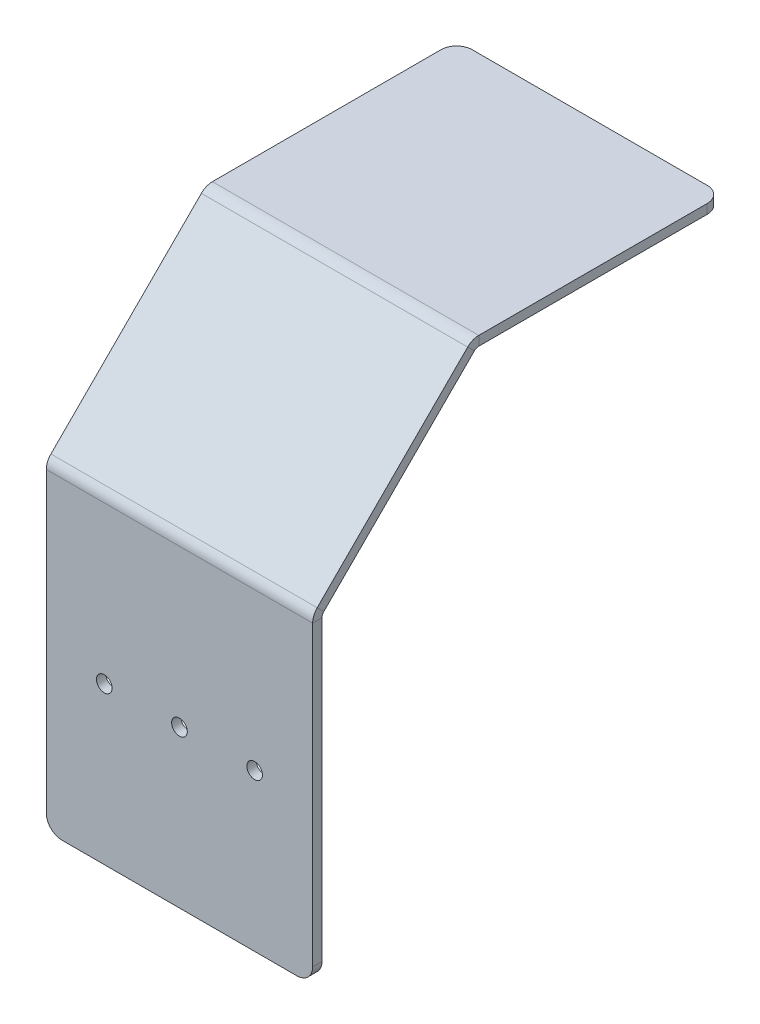
ISO-10303-21;
HEADER;
FILE_DESCRIPTION(('STEP AP214'),'2;1');
FILE_NAME('part.step','',(''),(''),'','','');
FILE_SCHEMA(('AUTOMOTIVE_DESIGN { 1 0 10303 214 1 1 1 1 }'));
ENDSEC;
DATA;
#1=APPLICATION_CONTEXT('core data for automotive mechanical design processes');
#2=APPLICATION_PROTOCOL_DEFINITION('international standard','automotive_design',2000,#1);
#3=PRODUCT_CONTEXT('',#1,'mechanical');
#4=PRODUCT('Part','Part','',(#3));
#5=PRODUCT_RELATED_PRODUCT_CATEGORY('part','',(#4));
#6=PRODUCT_DEFINITION_FORMATION('','',#4);
#7=PRODUCT_DEFINITION_CONTEXT('part definition',#1,'design');
#8=PRODUCT_DEFINITION('design','',#6,#7);
#9=PRODUCT_DEFINITION_SHAPE('','',#8);
#10=(LENGTH_UNIT() NAMED_UNIT(*) SI_UNIT(.MILLI.,.METRE.));
#11=(NAMED_UNIT(*) PLANE_ANGLE_UNIT() SI_UNIT($,.RADIAN.));
#12=(NAMED_UNIT(*) SI_UNIT($,.STERADIAN.) SOLID_ANGLE_UNIT());
#13=UNCERTAINTY_MEASURE_WITH_UNIT(LENGTH_MEASURE(1.E-05),#10,'distance_accuracy_value','');
#14=(GEOMETRIC_REPRESENTATION_CONTEXT(3) GLOBAL_UNCERTAINTY_ASSIGNED_CONTEXT((#13)) GLOBAL_UNIT_ASSIGNED_CONTEXT((#10,
#11,#12)) REPRESENTATION_CONTEXT('',''));
#15=CARTESIAN_POINT('',(0.,0.,0.));
#16=DIRECTION('',(0.,0.,1.));
#17=DIRECTION('',(1.,0.,0.));
#18=AXIS2_PLACEMENT_3D('',#15,#16,#17);
#19=CARTESIAN_POINT('',(42.5,50.,-3.));
#20=DIRECTION('',(1.,0.,0.));
#21=DIRECTION('',(0.,1.,0.));
#22=AXIS2_PLACEMENT_3D('',#19,#20,#21);
#23=PLANE('',#22);
#24=DIRECTION('',(0.,1.,0.));
#25=VECTOR('',#24,1.);
#26=CARTESIAN_POINT('',(42.5,50.,0.));
#27=LINE('',#26,#25);
#28=CARTESIAN_POINT('',(42.5,-45.,0.));
#29=VERTEX_POINT('',#28);
#30=CARTESIAN_POINT('',(42.5,50.,0.));
#31=VERTEX_POINT('',#30);
#32=EDGE_CURVE('E290',#29,#31,#27,.T.);
#33=ORIENTED_EDGE('',*,*,#32,.F.);
#34=DIRECTION('',(0.,0.,1.));
#35=VECTOR('',#34,1.);
#36=CARTESIAN_POINT('',(42.5,-45.,-3.));
#37=LINE('',#36,#35);
#38=CARTESIAN_POINT('',(42.5,-45.,-3.));
#39=VERTEX_POINT('',#38);
#40=EDGE_CURVE('E328',#29,#39,#37,.F.);
#41=ORIENTED_EDGE('',*,*,#40,.T.);
#42=DIRECTION('',(0.,1.,0.));
#43=VECTOR('',#42,1.);
#44=CARTESIAN_POINT('',(42.5,50.,-3.));
#45=LINE('',#44,#43);
#46=CARTESIAN_POINT('',(42.5,50.,-3.));
#47=VERTEX_POINT('',#46);
#48=EDGE_CURVE('E299',#39,#47,#45,.T.);
#49=ORIENTED_EDGE('',*,*,#48,.T.);
#50=DIRECTION('',(0.,0.,1.));
#51=VECTOR('',#50,1.);
#52=CARTESIAN_POINT('',(42.5,50.,-3.));
#53=LINE('',#52,#51);
#54=EDGE_CURVE('E309',#47,#31,#53,.T.);
#55=ORIENTED_EDGE('',*,*,#54,.T.);
#56=EDGE_LOOP('',(#33,#41,#49,#55));
#57=FACE_BOUND('',#56,.T.);
#58=ADVANCED_FACE('F77',(#57),#23,.T.);
#59=CARTESIAN_POINT('',(-42.5,-50.,-3.));
#60=DIRECTION('',(0.,-1.,0.));
#61=DIRECTION('',(0.,0.,-1.));
#62=AXIS2_PLACEMENT_3D('',#59,#60,#61);
#63=PLANE('',#62);
#64=DIRECTION('',(1.,0.,0.));
#65=VECTOR('',#64,1.);
#66=CARTESIAN_POINT('',(-42.5,-50.,0.));
#67=LINE('',#66,#65);
#68=CARTESIAN_POINT('',(-37.5,-50.,0.));
#69=VERTEX_POINT('',#68);
#70=CARTESIAN_POINT('',(37.5,-50.,0.));
#71=VERTEX_POINT('',#70);
#72=EDGE_CURVE('E302',#69,#71,#67,.T.);
#73=ORIENTED_EDGE('',*,*,#72,.F.);
#74=DIRECTION('',(0.,0.,1.));
#75=VECTOR('',#74,1.);
#76=CARTESIAN_POINT('',(-37.5,-50.,-3.));
#77=LINE('',#76,#75);
#78=CARTESIAN_POINT('',(-37.5,-50.,-3.));
#79=VERTEX_POINT('',#78);
#80=EDGE_CURVE('E338',#69,#79,#77,.F.);
#81=ORIENTED_EDGE('',*,*,#80,.T.);
#82=DIRECTION('',(1.,0.,0.));
#83=VECTOR('',#82,1.);
#84=CARTESIAN_POINT('',(-42.5,-50.,-3.));
#85=LINE('',#84,#83);
#86=CARTESIAN_POINT('',(37.5,-50.,-3.));
#87=VERTEX_POINT('',#86);
#88=EDGE_CURVE('E307',#79,#87,#85,.T.);
#89=ORIENTED_EDGE('',*,*,#88,.T.);
#90=DIRECTION('',(0.,0.,1.));
#91=VECTOR('',#90,1.);
#92=CARTESIAN_POINT('',(37.5,-50.,-3.));
#93=LINE('',#92,#91);
#94=EDGE_CURVE('E321',#87,#71,#93,.T.);
#95=ORIENTED_EDGE('',*,*,#94,.T.);
#96=EDGE_LOOP('',(#73,#81,#89,#95));
#97=FACE_BOUND('',#96,.T.);
#98=ADVANCED_FACE('F417',(#97),#63,.T.);
#99=CARTESIAN_POINT('',(-42.5,50.,-3.));
#100=DIRECTION('',(-1.,0.,0.));
#101=DIRECTION('',(0.,-1.,0.));
#102=AXIS2_PLACEMENT_3D('',#99,#100,#101);
#103=PLANE('',#102);
#104=DIRECTION('',(0.,-1.,0.));
#105=VECTOR('',#104,1.);
#106=CARTESIAN_POINT('',(-42.5,50.,-3.));
#107=LINE('',#106,#105);
#108=CARTESIAN_POINT('',(-42.5,50.,-3.));
#109=VERTEX_POINT('',#108);
#110=CARTESIAN_POINT('',(-42.5,-45.,-3.));
#111=VERTEX_POINT('',#110);
#112=EDGE_CURVE('E304',#109,#111,#107,.T.);
#113=ORIENTED_EDGE('',*,*,#112,.T.);
#114=DIRECTION('',(0.,0.,1.));
#115=VECTOR('',#114,1.);
#116=CARTESIAN_POINT('',(-42.5,-45.,-3.));
#117=LINE('',#116,#115);
#118=CARTESIAN_POINT('',(-42.5,-45.,0.));
#119=VERTEX_POINT('',#118);
#120=EDGE_CURVE('E333',#111,#119,#117,.T.);
#121=ORIENTED_EDGE('',*,*,#120,.T.);
#122=DIRECTION('',(0.,-1.,0.));
#123=VECTOR('',#122,1.);
#124=CARTESIAN_POINT('',(-42.5,50.,0.));
#125=LINE('',#124,#123);
#126=CARTESIAN_POINT('',(-42.5,50.,0.));
#127=VERTEX_POINT('',#126);
#128=EDGE_CURVE('E314',#127,#119,#125,.T.);
#129=ORIENTED_EDGE('',*,*,#128,.F.);
#130=DIRECTION('',(0.,0.,1.));
#131=VECTOR('',#130,1.);
#132=CARTESIAN_POINT('',(-42.5,50.,-3.));
#133=LINE('',#132,#131);
#134=EDGE_CURVE('E318',#109,#127,#133,.T.);
#135=ORIENTED_EDGE('',*,*,#134,.F.);
#136=EDGE_LOOP('',(#113,#121,#129,#135));
#137=FACE_BOUND('',#136,.T.);
#138=ADVANCED_FACE('F425',(#137),#103,.T.);
#139=CARTESIAN_POINT('',(0.,0.,-3.));
#140=DIRECTION('',(0.,0.,1.));
#141=DIRECTION('',(1.,0.,0.));
#142=AXIS2_PLACEMENT_3D('',#139,#140,#141);
#143=PLANE('',#142);
#144=CARTESIAN_POINT('',(-24.,0.,-3.));
#145=DIRECTION('',(0.,0.,1.));
#146=DIRECTION('',(1.,0.,0.));
#147=AXIS2_PLACEMENT_3D('',#144,#145,#146);
#148=CIRCLE('',#147,2.5);
#149=CARTESIAN_POINT('',(-21.5,0.,-3.));
#150=VERTEX_POINT('',#149);
#151=EDGE_CURVE('E254',#150,#150,#148,.T.);
#152=ORIENTED_EDGE('',*,*,#151,.T.);
#153=EDGE_LOOP('',(#152));
#154=FACE_BOUND('',#153,.T.);
#155=CARTESIAN_POINT('',(24.,0.,-3.));
#156=DIRECTION('',(0.,0.,1.));
#157=DIRECTION('',(1.,0.,0.));
#158=AXIS2_PLACEMENT_3D('',#155,#156,#157);
#159=CIRCLE('',#158,2.5);
#160=CARTESIAN_POINT('',(26.5,0.,-3.));
#161=VERTEX_POINT('',#160);
#162=EDGE_CURVE('E251',#161,#161,#159,.T.);
#163=ORIENTED_EDGE('',*,*,#162,.T.);
#164=EDGE_LOOP('',(#163));
#165=FACE_BOUND('',#164,.T.);
#166=CARTESIAN_POINT('',(0.,0.,-3.));
#167=DIRECTION('',(0.,0.,1.));
#168=DIRECTION('',(1.,0.,0.));
#169=AXIS2_PLACEMENT_3D('',#166,#167,#168);
#170=CIRCLE('',#169,2.5);
#171=CARTESIAN_POINT('',(2.5,0.,-3.));
#172=VERTEX_POINT('',#171);
#173=EDGE_CURVE('E248',#172,#172,#170,.T.);
#174=ORIENTED_EDGE('',*,*,#173,.T.);
#175=EDGE_LOOP('',(#174));
#176=FACE_BOUND('',#175,.T.);
#177=ORIENTED_EDGE('',*,*,#88,.F.);
#178=CARTESIAN_POINT('',(-37.5,-45.,-3.));
#179=DIRECTION('',(0.,0.,1.));
#180=DIRECTION('',(1.,0.,0.));
#181=AXIS2_PLACEMENT_3D('',#178,#179,#180);
#182=CIRCLE('',#181,5.);
#183=EDGE_CURVE('E340',#79,#111,#182,.F.);
#184=ORIENTED_EDGE('',*,*,#183,.T.);
#185=ORIENTED_EDGE('',*,*,#112,.F.);
#186=DIRECTION('',(-1.,0.,0.));
#187=VECTOR('',#186,1.);
#188=CARTESIAN_POINT('',(-42.5,50.,-3.));
#189=LINE('',#188,#187);
#190=EDGE_CURVE('E301',#47,#109,#189,.T.);
#191=ORIENTED_EDGE('',*,*,#190,.F.);
#192=ORIENTED_EDGE('',*,*,#48,.F.);
#193=CARTESIAN_POINT('',(37.5,-45.,-3.));
#194=DIRECTION('',(0.,0.,1.));
#195=DIRECTION('',(1.,0.,0.));
#196=AXIS2_PLACEMENT_3D('',#193,#194,#195);
#197=CIRCLE('',#196,5.);
#198=EDGE_CURVE('E330',#39,#87,#197,.F.);
#199=ORIENTED_EDGE('',*,*,#198,.T.);
#200=EDGE_LOOP('',(#177,#184,#185,#191,#192,#199));
#201=FACE_BOUND('',#200,.T.);
#202=ADVANCED_FACE('F409',(#154,#165,#176,#201),#143,.F.);
#203=CARTESIAN_POINT('',(0.,0.,0.));
#204=DIRECTION('',(0.,0.,1.));
#205=DIRECTION('',(1.,0.,0.));
#206=AXIS2_PLACEMENT_3D('',#203,#204,#205);
#207=PLANE('',#206);
#208=CARTESIAN_POINT('',(-24.,0.,0.));
#209=DIRECTION('',(0.,0.,1.));
#210=DIRECTION('',(1.,0.,0.));
#211=AXIS2_PLACEMENT_3D('',#208,#209,#210);
#212=CIRCLE('',#211,2.5);
#213=CARTESIAN_POINT('',(-21.5,0.,0.));
#214=VERTEX_POINT('',#213);
#215=EDGE_CURVE('E235',#214,#214,#212,.T.);
#216=ORIENTED_EDGE('',*,*,#215,.F.);
#217=EDGE_LOOP('',(#216));
#218=FACE_BOUND('',#217,.T.);
#219=CARTESIAN_POINT('',(24.,0.,0.));
#220=DIRECTION('',(0.,0.,1.));
#221=DIRECTION('',(1.,0.,0.));
#222=AXIS2_PLACEMENT_3D('',#219,#220,#221);
#223=CIRCLE('',#222,2.5);
#224=CARTESIAN_POINT('',(26.5,0.,0.));
#225=VERTEX_POINT('',#224);
#226=EDGE_CURVE('E240',#225,#225,#223,.T.);
#227=ORIENTED_EDGE('',*,*,#226,.F.);
#228=EDGE_LOOP('',(#227));
#229=FACE_BOUND('',#228,.T.);
#230=CARTESIAN_POINT('',(0.,0.,0.));
#231=DIRECTION('',(0.,0.,1.));
#232=DIRECTION('',(1.,0.,0.));
#233=AXIS2_PLACEMENT_3D('',#230,#231,#232);
#234=CIRCLE('',#233,2.5);
#235=CARTESIAN_POINT('',(2.5,0.,0.));
#236=VERTEX_POINT('',#235);
#237=EDGE_CURVE('E243',#236,#236,#234,.T.);
#238=ORIENTED_EDGE('',*,*,#237,.F.);
#239=EDGE_LOOP('',(#238));
#240=FACE_BOUND('',#239,.T.);
#241=ORIENTED_EDGE('',*,*,#128,.T.);
#242=CARTESIAN_POINT('',(-37.5,-45.,0.));
#243=DIRECTION('',(0.,0.,1.));
#244=DIRECTION('',(1.,0.,0.));
#245=AXIS2_PLACEMENT_3D('',#242,#243,#244);
#246=CIRCLE('',#245,5.);
#247=EDGE_CURVE('E336',#119,#69,#246,.T.);
#248=ORIENTED_EDGE('',*,*,#247,.T.);
#249=ORIENTED_EDGE('',*,*,#72,.T.);
#250=CARTESIAN_POINT('',(37.5,-45.,0.));
#251=DIRECTION('',(0.,0.,1.));
#252=DIRECTION('',(1.,0.,0.));
#253=AXIS2_PLACEMENT_3D('',#250,#251,#252);
#254=CIRCLE('',#253,5.);
#255=EDGE_CURVE('E326',#71,#29,#254,.T.);
#256=ORIENTED_EDGE('',*,*,#255,.T.);
#257=ORIENTED_EDGE('',*,*,#32,.T.);
#258=DIRECTION('',(-1.,0.,0.));
#259=VECTOR('',#258,1.);
#260=CARTESIAN_POINT('',(-42.5,50.,0.));
#261=LINE('',#260,#259);
#262=EDGE_CURVE('E311',#31,#127,#261,.T.);
#263=ORIENTED_EDGE('',*,*,#262,.T.);
#264=EDGE_LOOP('',(#241,#248,#249,#256,#257,#263));
#265=FACE_BOUND('',#264,.T.);
#266=ADVANCED_FACE('F428',(#218,#229,#240,#265),#207,.T.);
#267=CARTESIAN_POINT('',(-42.5,50.,-4.99999999999999));
#268=DIRECTION('',(-1.,0.,0.));
#269=DIRECTION('',(0.,0.,1.));
#270=AXIS2_PLACEMENT_3D('',#267,#268,#269);
#271=PLANE('',#270);
#272=DIRECTION('',(0.,0.707106781186544,0.707106781186551));
#273=VECTOR('',#272,1.);
#274=CARTESIAN_POINT('',(-42.5,53.5355339059327,-1.46446609406723));
#275=LINE('',#274,#273);
#276=CARTESIAN_POINT('',(-42.5,51.4142135623731,-3.5857864376269));
#277=VERTEX_POINT('',#276);
#278=CARTESIAN_POINT('',(-42.5,53.5355339059327,-1.46446609406725));
#279=VERTEX_POINT('',#278);
#280=EDGE_CURVE('E257',#277,#279,#275,.T.);
#281=ORIENTED_EDGE('',*,*,#280,.F.);
#282=CARTESIAN_POINT('',(-42.5,50.,-4.99999999999999));
#283=DIRECTION('',(1.,0.,0.));
#284=DIRECTION('',(0.,0.,-1.));
#285=AXIS2_PLACEMENT_3D('',#282,#283,#284);
#286=CIRCLE('',#285,1.99999999999999);
#287=EDGE_CURVE('E294',#109,#277,#286,.F.);
#288=ORIENTED_EDGE('',*,*,#287,.F.);
#289=ORIENTED_EDGE('',*,*,#134,.T.);
#290=CARTESIAN_POINT('',(-42.5,50.,-4.99999999999999));
#291=DIRECTION('',(1.,0.,0.));
#292=DIRECTION('',(0.,0.,-1.));
#293=AXIS2_PLACEMENT_3D('',#290,#291,#292);
#294=CIRCLE('',#293,4.99999999999999);
#295=EDGE_CURVE('E287',#127,#279,#294,.F.);
#296=ORIENTED_EDGE('',*,*,#295,.T.);
#297=EDGE_LOOP('',(#281,#288,#289,#296));
#298=FACE_BOUND('',#297,.T.);
#299=ADVANCED_FACE('F433',(#298),#271,.T.);
#300=CARTESIAN_POINT('',(42.5,50.,-4.99999999999999));
#301=DIRECTION('',(-1.,0.,0.));
#302=DIRECTION('',(0.,0.,1.));
#303=AXIS2_PLACEMENT_3D('',#300,#301,#302);
#304=PLANE('',#303);
#305=CARTESIAN_POINT('',(42.5,50.,-4.99999999999999));
#306=DIRECTION('',(1.,0.,0.));
#307=DIRECTION('',(0.,0.,-1.));
#308=AXIS2_PLACEMENT_3D('',#305,#306,#307);
#309=CIRCLE('',#308,1.99999999999999);
#310=CARTESIAN_POINT('',(42.5,51.4142135623731,-3.5857864376269));
#311=VERTEX_POINT('',#310);
#312=EDGE_CURVE('E260',#311,#47,#309,.T.);
#313=ORIENTED_EDGE('',*,*,#312,.F.);
#314=DIRECTION('',(0.,0.707106781186544,0.707106781186551));
#315=VECTOR('',#314,1.);
#316=CARTESIAN_POINT('',(42.5,51.4142135623731,-3.58578643762689));
#317=LINE('',#316,#315);
#318=CARTESIAN_POINT('',(42.5,53.5355339059327,-1.46446609406724));
#319=VERTEX_POINT('',#318);
#320=EDGE_CURVE('E280',#311,#319,#317,.T.);
#321=ORIENTED_EDGE('',*,*,#320,.T.);
#322=CARTESIAN_POINT('',(42.5,50.,-4.99999999999999));
#323=DIRECTION('',(1.,0.,0.));
#324=DIRECTION('',(0.,0.,-1.));
#325=AXIS2_PLACEMENT_3D('',#322,#323,#324);
#326=CIRCLE('',#325,4.99999999999999);
#327=EDGE_CURVE('E291',#319,#31,#326,.T.);
#328=ORIENTED_EDGE('',*,*,#327,.T.);
#329=ORIENTED_EDGE('',*,*,#54,.F.);
#330=EDGE_LOOP('',(#313,#321,#328,#329));
#331=FACE_BOUND('',#330,.T.);
#332=ADVANCED_FACE('F401',(#331),#304,.F.);
#333=CARTESIAN_POINT('',(42.5,50.,-4.99999999999999));
#334=DIRECTION('',(1.,0.,0.));
#335=DIRECTION('',(0.,0.707106781186544,0.707106781186551));
#336=AXIS2_PLACEMENT_3D('',#333,#334,#335);
#337=CYLINDRICAL_SURFACE('',#336,4.99999999999999);
#338=ORIENTED_EDGE('',*,*,#262,.F.);
#339=ORIENTED_EDGE('',*,*,#327,.F.);
#340=DIRECTION('',(1.,0.,0.));
#341=VECTOR('',#340,1.);
#342=CARTESIAN_POINT('',(0.,53.5355339059327,-1.46446609406724));
#343=LINE('',#342,#341);
#344=EDGE_CURVE('E277',#279,#319,#343,.T.);
#345=ORIENTED_EDGE('',*,*,#344,.F.);
#346=ORIENTED_EDGE('',*,*,#295,.F.);
#347=EDGE_LOOP('',(#338,#339,#345,#346));
#348=FACE_BOUND('',#347,.T.);
#349=ADVANCED_FACE('F431',(#348),#337,.T.);
#350=CARTESIAN_POINT('',(42.5,50.,-4.99999999999999));
#351=DIRECTION('',(1.,0.,0.));
#352=DIRECTION('',(0.,0.707106781186544,0.707106781186551));
#353=AXIS2_PLACEMENT_3D('',#350,#351,#352);
#354=CYLINDRICAL_SURFACE('',#353,1.99999999999999);
#355=ORIENTED_EDGE('',*,*,#190,.T.);
#356=ORIENTED_EDGE('',*,*,#287,.T.);
#357=DIRECTION('',(-1.,0.,0.));
#358=VECTOR('',#357,1.);
#359=CARTESIAN_POINT('',(-42.5,51.4142135623731,-3.58578643762689));
#360=LINE('',#359,#358);
#361=EDGE_CURVE('E283',#277,#311,#360,.F.);
#362=ORIENTED_EDGE('',*,*,#361,.T.);
#363=ORIENTED_EDGE('',*,*,#312,.T.);
#364=EDGE_LOOP('',(#355,#356,#362,#363));
#365=FACE_BOUND('',#364,.T.);
#366=ADVANCED_FACE('F396',(#365),#354,.F.);
#367=CARTESIAN_POINT('',(42.5,52.9497474683058,-0.878679656440346));
#368=DIRECTION('',(1.,0.,0.));
#369=DIRECTION('',(0.,0.,-1.));
#370=AXIS2_PLACEMENT_3D('',#367,#368,#369);
#371=PLANE('',#370);
#372=DIRECTION('',(0.,-0.707106781186551,0.707106781186544));
#373=VECTOR('',#372,1.);
#374=CARTESIAN_POINT('',(42.5,52.9497474683058,-0.878679656440346));
#375=LINE('',#374,#373);
#376=CARTESIAN_POINT('',(42.5,101.568542494924,-49.497474683058));
#377=VERTEX_POINT('',#376);
#378=EDGE_CURVE('E264',#377,#319,#375,.T.);
#379=ORIENTED_EDGE('',*,*,#378,.T.);
#380=ORIENTED_EDGE('',*,*,#320,.F.);
#381=DIRECTION('',(0.,0.707106781186551,-0.707106781186544));
#382=VECTOR('',#381,1.);
#383=CARTESIAN_POINT('',(42.5,24.3284271247459,23.5));
#384=LINE('',#383,#382);
#385=CARTESIAN_POINT('',(42.5,99.4472221513644,-51.6187950266177));
#386=VERTEX_POINT('',#385);
#387=EDGE_CURVE('E270',#386,#311,#384,.F.);
#388=ORIENTED_EDGE('',*,*,#387,.F.);
#389=DIRECTION('',(0.,-0.707106781186544,-0.707106781186551));
#390=VECTOR('',#389,1.);
#391=CARTESIAN_POINT('',(42.5,101.568542494924,-49.4974746830581));
#392=LINE('',#391,#390);
#393=EDGE_CURVE('E258',#377,#386,#392,.T.);
#394=ORIENTED_EDGE('',*,*,#393,.F.);
#395=EDGE_LOOP('',(#379,#380,#388,#394));
#396=FACE_BOUND('',#395,.T.);
#397=ADVANCED_FACE('F390',(#396),#371,.T.);
#398=CARTESIAN_POINT('',(-42.5,101.568542494924,-49.4974746830581));
#399=DIRECTION('',(-1.,0.,0.));
#400=DIRECTION('',(0.,0.,1.));
#401=AXIS2_PLACEMENT_3D('',#398,#399,#400);
#402=PLANE('',#401);
#403=DIRECTION('',(0.,-0.707106781186551,0.707106781186544));
#404=VECTOR('',#403,1.);
#405=CARTESIAN_POINT('',(-42.5,24.3284271247459,23.5));
#406=LINE('',#405,#404);
#407=CARTESIAN_POINT('',(-42.5,99.4472221513644,-51.6187950266177));
#408=VERTEX_POINT('',#407);
#409=EDGE_CURVE('E275',#277,#408,#406,.F.);
#410=ORIENTED_EDGE('',*,*,#409,.F.);
#411=ORIENTED_EDGE('',*,*,#280,.T.);
#412=DIRECTION('',(0.,0.707106781186551,-0.707106781186544));
#413=VECTOR('',#412,1.);
#414=CARTESIAN_POINT('',(-42.5,101.568542494924,-49.4974746830581));
#415=LINE('',#414,#413);
#416=CARTESIAN_POINT('',(-42.5,101.568542494924,-49.4974746830581));
#417=VERTEX_POINT('',#416);
#418=EDGE_CURVE('E268',#279,#417,#415,.T.);
#419=ORIENTED_EDGE('',*,*,#418,.T.);
#420=DIRECTION('',(0.,-0.707106781186544,-0.707106781186551));
#421=VECTOR('',#420,1.);
#422=CARTESIAN_POINT('',(-42.5,101.568542494924,-49.4974746830581));
#423=LINE('',#422,#421);
#424=EDGE_CURVE('E261',#417,#408,#423,.T.);
#425=ORIENTED_EDGE('',*,*,#424,.T.);
#426=EDGE_LOOP('',(#410,#411,#419,#425));
#427=FACE_BOUND('',#426,.T.);
#428=ADVANCED_FACE('F382',(#427),#402,.T.);
#429=CARTESIAN_POINT('',(0.,26.4497474683055,25.6213203435596));
#430=DIRECTION('',(0.,0.707106781186544,0.707106781186551));
#431=DIRECTION('',(0.,-0.707106781186551,0.707106781186544));
#432=AXIS2_PLACEMENT_3D('',#429,#430,#431);
#433=PLANE('',#432);
#434=ORIENTED_EDGE('',*,*,#418,.F.);
#435=ORIENTED_EDGE('',*,*,#344,.T.);
#436=ORIENTED_EDGE('',*,*,#378,.F.);
#437=DIRECTION('',(1.,0.,0.));
#438=VECTOR('',#437,1.);
#439=CARTESIAN_POINT('',(42.5,101.568542494924,-49.4974746830581));
#440=LINE('',#439,#438);
#441=EDGE_CURVE('E210',#417,#377,#440,.T.);
#442=ORIENTED_EDGE('',*,*,#441,.F.);
#443=EDGE_LOOP('',(#434,#435,#436,#442));
#444=FACE_BOUND('',#443,.T.);
#445=ADVANCED_FACE('F385',(#444),#433,.T.);
#446=CARTESIAN_POINT('',(0.,24.3284271247459,23.5));
#447=DIRECTION('',(0.,0.707106781186544,0.707106781186551));
#448=DIRECTION('',(0.,-0.707106781186551,0.707106781186544));
#449=AXIS2_PLACEMENT_3D('',#446,#447,#448);
#450=PLANE('',#449);
#451=ORIENTED_EDGE('',*,*,#361,.F.);
#452=ORIENTED_EDGE('',*,*,#409,.T.);
#453=DIRECTION('',(-1.,0.,0.));
#454=VECTOR('',#453,1.);
#455=CARTESIAN_POINT('',(0.,99.4472221513644,-51.6187950266177));
#456=LINE('',#455,#454);
#457=EDGE_CURVE('E273',#408,#386,#456,.F.);
#458=ORIENTED_EDGE('',*,*,#457,.T.);
#459=ORIENTED_EDGE('',*,*,#387,.T.);
#460=EDGE_LOOP('',(#451,#452,#458,#459));
#461=FACE_BOUND('',#460,.T.);
#462=ADVANCED_FACE('F393',(#461),#450,.F.);
#463=CARTESIAN_POINT('',(0.,0.,-35.));
#464=DIRECTION('',(0.,0.,1.));
#465=DIRECTION('',(1.,0.,0.));
#466=AXIS2_PLACEMENT_3D('',#463,#464,#465);
#467=CYLINDRICAL_SURFACE('',#466,2.5);
#468=ORIENTED_EDGE('',*,*,#237,.T.);
#469=EDGE_LOOP('',(#468));
#470=FACE_BOUND('',#469,.T.);
#471=ORIENTED_EDGE('',*,*,#173,.F.);
#472=EDGE_LOOP('',(#471));
#473=FACE_BOUND('',#472,.T.);
#474=ADVANCED_FACE('F481',(#470,#473),#467,.F.);
#475=CARTESIAN_POINT('',(24.,0.,-35.));
#476=DIRECTION('',(0.,0.,1.));
#477=DIRECTION('',(1.,0.,0.));
#478=AXIS2_PLACEMENT_3D('',#475,#476,#477);
#479=CYLINDRICAL_SURFACE('',#478,2.5);
#480=ORIENTED_EDGE('',*,*,#226,.T.);
#481=EDGE_LOOP('',(#480));
#482=FACE_BOUND('',#481,.T.);
#483=ORIENTED_EDGE('',*,*,#162,.F.);
#484=EDGE_LOOP('',(#483));
#485=FACE_BOUND('',#484,.T.);
#486=ADVANCED_FACE('F478',(#482,#485),#479,.F.);
#487=CARTESIAN_POINT('',(-24.,0.,-35.));
#488=DIRECTION('',(0.,0.,1.));
#489=DIRECTION('',(1.,0.,0.));
#490=AXIS2_PLACEMENT_3D('',#487,#488,#489);
#491=CYLINDRICAL_SURFACE('',#490,2.5);
#492=ORIENTED_EDGE('',*,*,#215,.T.);
#493=EDGE_LOOP('',(#492));
#494=FACE_BOUND('',#493,.T.);
#495=ORIENTED_EDGE('',*,*,#151,.F.);
#496=EDGE_LOOP('',(#495));
#497=FACE_BOUND('',#496,.T.);
#498=ADVANCED_FACE('F454',(#494,#497),#491,.F.);
#499=CARTESIAN_POINT('',(37.5,-45.,-3.));
#500=DIRECTION('',(0.,0.,1.));
#501=DIRECTION('',(1.,0.,0.));
#502=AXIS2_PLACEMENT_3D('',#499,#500,#501);
#503=CYLINDRICAL_SURFACE('',#502,5.);
#504=ORIENTED_EDGE('',*,*,#198,.F.);
#505=ORIENTED_EDGE('',*,*,#40,.F.);
#506=ORIENTED_EDGE('',*,*,#255,.F.);
#507=ORIENTED_EDGE('',*,*,#94,.F.);
#508=EDGE_LOOP('',(#504,#505,#506,#507));
#509=FACE_BOUND('',#508,.T.);
#510=ADVANCED_FACE('F413',(#509),#503,.T.);
#511=CARTESIAN_POINT('',(-37.5,-45.,-3.));
#512=DIRECTION('',(0.,0.,1.));
#513=DIRECTION('',(1.,0.,0.));
#514=AXIS2_PLACEMENT_3D('',#511,#512,#513);
#515=CYLINDRICAL_SURFACE('',#514,5.);
#516=ORIENTED_EDGE('',*,*,#183,.F.);
#517=ORIENTED_EDGE('',*,*,#80,.F.);
#518=ORIENTED_EDGE('',*,*,#247,.F.);
#519=ORIENTED_EDGE('',*,*,#120,.F.);
#520=EDGE_LOOP('',(#516,#517,#518,#519));
#521=FACE_BOUND('',#520,.T.);
#522=ADVANCED_FACE('F422',(#521),#515,.T.);
#523=CARTESIAN_POINT('',(-42.5,98.0330085889913,-53.0330085889908));
#524=DIRECTION('',(-1.,0.,0.));
#525=DIRECTION('',(0.,0.,1.));
#526=AXIS2_PLACEMENT_3D('',#523,#524,#525);
#527=PLANE('',#526);
#528=DIRECTION('',(0.,1.,0.));
#529=VECTOR('',#528,1.);
#530=CARTESIAN_POINT('',(-42.5,103.033008588991,-53.0330085889908));
#531=LINE('',#530,#529);
#532=CARTESIAN_POINT('',(-42.5,100.033008588991,-53.0330085889908));
#533=VERTEX_POINT('',#532);
#534=CARTESIAN_POINT('',(-42.5,103.033008588991,-53.0330085889908));
#535=VERTEX_POINT('',#534);
#536=EDGE_CURVE('E232',#533,#535,#531,.T.);
#537=ORIENTED_EDGE('',*,*,#536,.F.);
#538=CARTESIAN_POINT('',(-42.5,98.0330085889913,-53.0330085889908));
#539=DIRECTION('',(1.,0.,0.));
#540=DIRECTION('',(0.,0.,-1.));
#541=AXIS2_PLACEMENT_3D('',#538,#539,#540);
#542=CIRCLE('',#541,2.00000000000002);
#543=EDGE_CURVE('E214',#408,#533,#542,.F.);
#544=ORIENTED_EDGE('',*,*,#543,.F.);
#545=ORIENTED_EDGE('',*,*,#424,.F.);
#546=CARTESIAN_POINT('',(-42.5,98.0330085889913,-53.0330085889908));
#547=DIRECTION('',(1.,0.,0.));
#548=DIRECTION('',(0.,0.,-1.));
#549=AXIS2_PLACEMENT_3D('',#546,#547,#548);
#550=CIRCLE('',#549,5.00000000000002);
#551=EDGE_CURVE('E213',#417,#535,#550,.F.);
#552=ORIENTED_EDGE('',*,*,#551,.T.);
#553=EDGE_LOOP('',(#537,#544,#545,#552));
#554=FACE_BOUND('',#553,.T.);
#555=ADVANCED_FACE('F379',(#554),#527,.T.);
#556=CARTESIAN_POINT('',(42.5,98.0330085889913,-53.0330085889908));
#557=DIRECTION('',(-1.,0.,0.));
#558=DIRECTION('',(0.,0.,1.));
#559=AXIS2_PLACEMENT_3D('',#556,#557,#558);
#560=PLANE('',#559);
#561=CARTESIAN_POINT('',(42.5,98.0330085889913,-53.0330085889908));
#562=DIRECTION('',(1.,0.,0.));
#563=DIRECTION('',(0.,0.,-1.));
#564=AXIS2_PLACEMENT_3D('',#561,#562,#563);
#565=CIRCLE('',#564,2.00000000000002);
#566=CARTESIAN_POINT('',(42.5,100.033008588991,-53.0330085889908));
#567=VERTEX_POINT('',#566);
#568=EDGE_CURVE('E198',#567,#386,#565,.T.);
#569=ORIENTED_EDGE('',*,*,#568,.F.);
#570=DIRECTION('',(0.,1.,0.));
#571=VECTOR('',#570,1.);
#572=CARTESIAN_POINT('',(42.5,100.033008588991,-53.0330085889908));
#573=LINE('',#572,#571);
#574=CARTESIAN_POINT('',(42.5,103.033008588991,-53.0330085889908));
#575=VERTEX_POINT('',#574);
#576=EDGE_CURVE('E195',#567,#575,#573,.T.);
#577=ORIENTED_EDGE('',*,*,#576,.T.);
#578=CARTESIAN_POINT('',(42.5,98.0330085889913,-53.0330085889908));
#579=DIRECTION('',(1.,0.,0.));
#580=DIRECTION('',(0.,0.,-1.));
#581=AXIS2_PLACEMENT_3D('',#578,#579,#580);
#582=CIRCLE('',#581,5.00000000000002);
#583=EDGE_CURVE('E204',#575,#377,#582,.T.);
#584=ORIENTED_EDGE('',*,*,#583,.T.);
#585=ORIENTED_EDGE('',*,*,#393,.T.);
#586=EDGE_LOOP('',(#569,#577,#584,#585));
#587=FACE_BOUND('',#586,.T.);
#588=ADVANCED_FACE('F217',(#587),#560,.F.);
#589=CARTESIAN_POINT('',(42.5,98.0330085889913,-53.0330085889908));
#590=DIRECTION('',(1.,0.,0.));
#591=DIRECTION('',(0.,1.,0.));
#592=AXIS2_PLACEMENT_3D('',#589,#590,#591);
#593=CYLINDRICAL_SURFACE('',#592,5.00000000000002);
#594=ORIENTED_EDGE('',*,*,#441,.T.);
#595=ORIENTED_EDGE('',*,*,#583,.F.);
#596=DIRECTION('',(1.,0.,0.));
#597=VECTOR('',#596,1.);
#598=CARTESIAN_POINT('',(0.,103.033008588991,-53.0330085889908));
#599=LINE('',#598,#597);
#600=EDGE_CURVE('E207',#535,#575,#599,.T.);
#601=ORIENTED_EDGE('',*,*,#600,.F.);
#602=ORIENTED_EDGE('',*,*,#551,.F.);
#603=EDGE_LOOP('',(#594,#595,#601,#602));
#604=FACE_BOUND('',#603,.T.);
#605=ADVANCED_FACE('F205',(#604),#593,.T.);
#606=CARTESIAN_POINT('',(42.5,98.0330085889913,-53.0330085889908));
#607=DIRECTION('',(1.,0.,0.));
#608=DIRECTION('',(0.,1.,0.));
#609=AXIS2_PLACEMENT_3D('',#606,#607,#608);
#610=CYLINDRICAL_SURFACE('',#609,2.00000000000002);
#611=ORIENTED_EDGE('',*,*,#457,.F.);
#612=ORIENTED_EDGE('',*,*,#543,.T.);
#613=DIRECTION('',(-1.,0.,0.));
#614=VECTOR('',#613,1.);
#615=CARTESIAN_POINT('',(-42.5,100.033008588991,-53.0330085889908));
#616=LINE('',#615,#614);
#617=EDGE_CURVE('E219',#533,#567,#616,.F.);
#618=ORIENTED_EDGE('',*,*,#617,.T.);
#619=ORIENTED_EDGE('',*,*,#568,.T.);
#620=EDGE_LOOP('',(#611,#612,#618,#619));
#621=FACE_BOUND('',#620,.T.);
#622=ADVANCED_FACE('F375',(#621),#610,.F.);
#623=CARTESIAN_POINT('',(42.5,103.033008588991,-52.2045814642446));
#624=DIRECTION('',(1.,0.,0.));
#625=DIRECTION('',(0.,0.,-1.));
#626=AXIS2_PLACEMENT_3D('',#623,#624,#625);
#627=PLANE('',#626);
#628=DIRECTION('',(0.,0.,-1.));
#629=VECTOR('',#628,1.);
#630=CARTESIAN_POINT('',(42.5,100.033008588991,-0.585786437625846));
#631=LINE('',#630,#629);
#632=CARTESIAN_POINT('',(42.5,100.033008588992,-125.961940777125));
#633=VERTEX_POINT('',#632);
#634=EDGE_CURVE('E365',#633,#567,#631,.F.);
#635=ORIENTED_EDGE('',*,*,#634,.F.);
#636=DIRECTION('',(0.,-1.,0.));
#637=VECTOR('',#636,1.);
#638=CARTESIAN_POINT('',(42.5,103.033008588992,-125.961940777125));
#639=LINE('',#638,#637);
#640=CARTESIAN_POINT('',(42.5,103.033008588992,-125.961940777125));
#641=VERTEX_POINT('',#640);
#642=EDGE_CURVE('E100',#633,#641,#639,.F.);
#643=ORIENTED_EDGE('',*,*,#642,.T.);
#644=DIRECTION('',(0.,0.,1.));
#645=VECTOR('',#644,1.);
#646=CARTESIAN_POINT('',(42.5,103.033008588991,-52.2045814642446));
#647=LINE('',#646,#645);
#648=EDGE_CURVE('E191',#641,#575,#647,.T.);
#649=ORIENTED_EDGE('',*,*,#648,.T.);
#650=ORIENTED_EDGE('',*,*,#576,.F.);
#651=EDGE_LOOP('',(#635,#643,#649,#650));
#652=FACE_BOUND('',#651,.T.);
#653=ADVANCED_FACE('F193',(#652),#627,.T.);
#654=CARTESIAN_POINT('',(-42.5,103.033008588992,-130.961940777125));
#655=DIRECTION('',(-1.,0.,0.));
#656=DIRECTION('',(0.,0.,1.));
#657=AXIS2_PLACEMENT_3D('',#654,#655,#656);
#658=PLANE('',#657);
#659=DIRECTION('',(0.,0.,-1.));
#660=VECTOR('',#659,1.);
#661=CARTESIAN_POINT('',(-42.5,103.033008588992,-130.961940777125));
#662=LINE('',#661,#660);
#663=CARTESIAN_POINT('',(-42.5,103.033008588992,-125.961940777125));
#664=VERTEX_POINT('',#663);
#665=EDGE_CURVE('E222',#535,#664,#662,.T.);
#666=ORIENTED_EDGE('',*,*,#665,.T.);
#667=DIRECTION('',(0.,-1.,0.));
#668=VECTOR('',#667,1.);
#669=CARTESIAN_POINT('',(-42.5,103.033008588992,-125.961940777125));
#670=LINE('',#669,#668);
#671=CARTESIAN_POINT('',(-42.5,100.033008588992,-125.961940777125));
#672=VERTEX_POINT('',#671);
#673=EDGE_CURVE('E13',#664,#672,#670,.T.);
#674=ORIENTED_EDGE('',*,*,#673,.T.);
#675=DIRECTION('',(0.,0.,1.));
#676=VECTOR('',#675,1.);
#677=CARTESIAN_POINT('',(-42.5,100.033008588991,-0.58578643762585));
#678=LINE('',#677,#676);
#679=EDGE_CURVE('E223',#533,#672,#678,.F.);
#680=ORIENTED_EDGE('',*,*,#679,.F.);
#681=ORIENTED_EDGE('',*,*,#536,.T.);
#682=EDGE_LOOP('',(#666,#674,#680,#681));
#683=FACE_BOUND('',#682,.T.);
#684=ADVANCED_FACE('F370',(#683),#658,.T.);
#685=CARTESIAN_POINT('',(0.,103.033008588991,-0.585786437625815));
#686=DIRECTION('',(0.,1.,0.));
#687=DIRECTION('',(0.,0.,1.));
#688=AXIS2_PLACEMENT_3D('',#685,#686,#687);
#689=PLANE('',#688);
#690=ORIENTED_EDGE('',*,*,#648,.F.);
#691=CARTESIAN_POINT('',(37.5,103.033008588992,-125.961940777125));
#692=DIRECTION('',(0.,1.,0.));
#693=DIRECTION('',(0.,0.,1.));
#694=AXIS2_PLACEMENT_3D('',#691,#692,#693);
#695=CIRCLE('',#694,5.);
#696=CARTESIAN_POINT('',(37.5,103.033008588992,-130.961940777125));
#697=VERTEX_POINT('',#696);
#698=EDGE_CURVE('E85',#641,#697,#695,.T.);
#699=ORIENTED_EDGE('',*,*,#698,.T.);
#700=DIRECTION('',(1.,0.,0.));
#701=VECTOR('',#700,1.);
#702=CARTESIAN_POINT('',(42.5,103.033008588992,-130.961940777125));
#703=LINE('',#702,#701);
#704=CARTESIAN_POINT('',(-37.5,103.033008588992,-130.961940777125));
#705=VERTEX_POINT('',#704);
#706=EDGE_CURVE('E199',#705,#697,#703,.T.);
#707=ORIENTED_EDGE('',*,*,#706,.F.);
#708=CARTESIAN_POINT('',(-37.5,103.033008588992,-125.961940777125));
#709=DIRECTION('',(0.,1.,0.));
#710=DIRECTION('',(0.,0.,1.));
#711=AXIS2_PLACEMENT_3D('',#708,#709,#710);
#712=CIRCLE('',#711,5.);
#713=EDGE_CURVE('E92',#705,#664,#712,.T.);
#714=ORIENTED_EDGE('',*,*,#713,.T.);
#715=ORIENTED_EDGE('',*,*,#665,.F.);
#716=ORIENTED_EDGE('',*,*,#600,.T.);
#717=EDGE_LOOP('',(#690,#699,#707,#714,#715,#716));
#718=FACE_BOUND('',#717,.T.);
#719=ADVANCED_FACE('F221',(#718),#689,.T.);
#720=CARTESIAN_POINT('',(0.,100.033008588991,-0.585786437625846));
#721=DIRECTION('',(0.,1.,0.));
#722=DIRECTION('',(0.,0.,1.));
#723=AXIS2_PLACEMENT_3D('',#720,#721,#722);
#724=PLANE('',#723);
#725=DIRECTION('',(-1.,0.,0.));
#726=VECTOR('',#725,1.);
#727=CARTESIAN_POINT('',(0.,100.033008588992,-130.961940777125));
#728=LINE('',#727,#726);
#729=CARTESIAN_POINT('',(-37.5,100.033008588992,-130.961940777125));
#730=VERTEX_POINT('',#729);
#731=CARTESIAN_POINT('',(37.5,100.033008588992,-130.961940777125));
#732=VERTEX_POINT('',#731);
#733=EDGE_CURVE('E226',#730,#732,#728,.F.);
#734=ORIENTED_EDGE('',*,*,#733,.T.);
#735=CARTESIAN_POINT('',(37.5,100.033008588992,-125.961940777125));
#736=DIRECTION('',(0.,1.,0.));
#737=DIRECTION('',(0.,0.,1.));
#738=AXIS2_PLACEMENT_3D('',#735,#736,#737);
#739=CIRCLE('',#738,5.);
#740=EDGE_CURVE('E349',#732,#633,#739,.F.);
#741=ORIENTED_EDGE('',*,*,#740,.T.);
#742=ORIENTED_EDGE('',*,*,#634,.T.);
#743=ORIENTED_EDGE('',*,*,#617,.F.);
#744=ORIENTED_EDGE('',*,*,#679,.T.);
#745=CARTESIAN_POINT('',(-37.5,100.033008588992,-125.961940777125));
#746=DIRECTION('',(0.,1.,0.));
#747=DIRECTION('',(0.,0.,1.));
#748=AXIS2_PLACEMENT_3D('',#745,#746,#747);
#749=CIRCLE('',#748,5.);
#750=EDGE_CURVE('E347',#672,#730,#749,.F.);
#751=ORIENTED_EDGE('',*,*,#750,.T.);
#752=EDGE_LOOP('',(#734,#741,#742,#743,#744,#751));
#753=FACE_BOUND('',#752,.T.);
#754=ADVANCED_FACE('F363',(#753),#724,.F.);
#755=CARTESIAN_POINT('',(42.5,103.033008588992,-130.961940777125));
#756=DIRECTION('',(0.,0.,-1.));
#757=DIRECTION('',(0.,1.,0.));
#758=AXIS2_PLACEMENT_3D('',#755,#756,#757);
#759=PLANE('',#758);
#760=ORIENTED_EDGE('',*,*,#706,.T.);
#761=DIRECTION('',(0.,-1.,0.));
#762=VECTOR('',#761,1.);
#763=CARTESIAN_POINT('',(37.5,103.033008588992,-130.961940777125));
#764=LINE('',#763,#762);
#765=EDGE_CURVE('E344',#697,#732,#764,.T.);
#766=ORIENTED_EDGE('',*,*,#765,.T.);
#767=ORIENTED_EDGE('',*,*,#733,.F.);
#768=DIRECTION('',(0.,-1.,0.));
#769=VECTOR('',#768,1.);
#770=CARTESIAN_POINT('',(-37.5,103.033008588992,-130.961940777125));
#771=LINE('',#770,#769);
#772=EDGE_CURVE('E342',#730,#705,#771,.F.);
#773=ORIENTED_EDGE('',*,*,#772,.T.);
#774=EDGE_LOOP('',(#760,#766,#767,#773));
#775=FACE_BOUND('',#774,.T.);
#776=ADVANCED_FACE('F356',(#775),#759,.T.);
#777=CARTESIAN_POINT('',(37.5,103.033008588992,-125.961940777125));
#778=DIRECTION('',(0.,-1.,0.));
#779=DIRECTION('',(0.,0.,-1.));
#780=AXIS2_PLACEMENT_3D('',#777,#778,#779);
#781=CYLINDRICAL_SURFACE('',#780,5.);
#782=ORIENTED_EDGE('',*,*,#698,.F.);
#783=ORIENTED_EDGE('',*,*,#642,.F.);
#784=ORIENTED_EDGE('',*,*,#740,.F.);
#785=ORIENTED_EDGE('',*,*,#765,.F.);
#786=EDGE_LOOP('',(#782,#783,#784,#785));
#787=FACE_BOUND('',#786,.T.);
#788=ADVANCED_FACE('F361',(#787),#781,.T.);
#789=CARTESIAN_POINT('',(-37.5,103.033008588992,-125.961940777125));
#790=DIRECTION('',(0.,-1.,0.));
#791=DIRECTION('',(0.,0.,-1.));
#792=AXIS2_PLACEMENT_3D('',#789,#790,#791);
#793=CYLINDRICAL_SURFACE('',#792,5.);
#794=ORIENTED_EDGE('',*,*,#713,.F.);
#795=ORIENTED_EDGE('',*,*,#772,.F.);
#796=ORIENTED_EDGE('',*,*,#750,.F.);
#797=ORIENTED_EDGE('',*,*,#673,.F.);
#798=EDGE_LOOP('',(#794,#795,#796,#797));
#799=FACE_BOUND('',#798,.T.);
#800=ADVANCED_FACE('F79',(#799),#793,.T.);
#801=CLOSED_SHELL('',(#58,#98,#138,#202,#266,#299,#332,#349,#366,#397,#428,#445,#462,#474,#486,
#498,#510,#522,#555,#588,#605,#622,#653,#684,#719,#754,#776,#788,#800));
#802=MANIFOLD_SOLID_BREP('B2',#801);
#803=ADVANCED_BREP_SHAPE_REPRESENTATION('',(#18,#802),#14);
#804=SHAPE_DEFINITION_REPRESENTATION(#9,#803);
ENDSEC;
END-ISO-10303-21;
